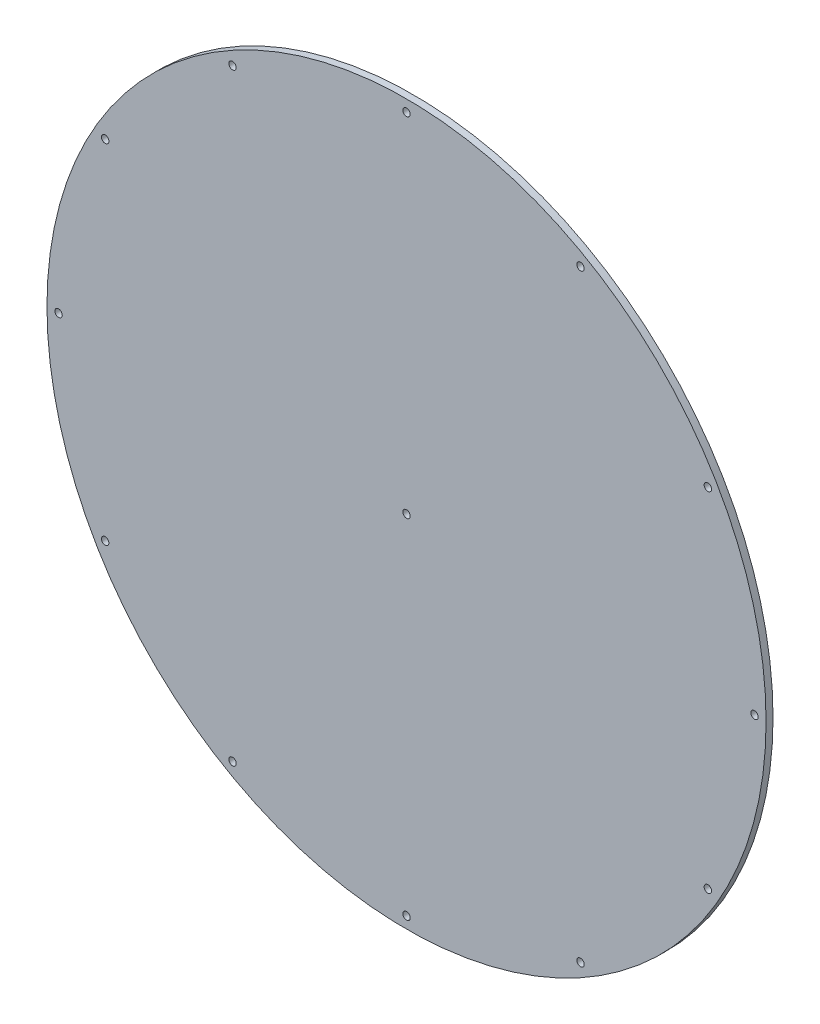
ISO-10303-21;
HEADER;
FILE_DESCRIPTION(('STEP AP214'),'2;1');
FILE_NAME('part.step','',(''),(''),'','','');
FILE_SCHEMA(('AUTOMOTIVE_DESIGN { 1 0 10303 214 1 1 1 1 }'));
ENDSEC;
DATA;
#1=APPLICATION_CONTEXT('core data for automotive mechanical design processes');
#2=APPLICATION_PROTOCOL_DEFINITION('international standard','automotive_design',2000,#1);
#3=PRODUCT_CONTEXT('',#1,'mechanical');
#4=PRODUCT('Part','Part','',(#3));
#5=PRODUCT_RELATED_PRODUCT_CATEGORY('part','',(#4));
#6=PRODUCT_DEFINITION_FORMATION('','',#4);
#7=PRODUCT_DEFINITION_CONTEXT('part definition',#1,'design');
#8=PRODUCT_DEFINITION('design','',#6,#7);
#9=PRODUCT_DEFINITION_SHAPE('','',#8);
#10=(LENGTH_UNIT() NAMED_UNIT(*) SI_UNIT(.MILLI.,.METRE.));
#11=(NAMED_UNIT(*) PLANE_ANGLE_UNIT() SI_UNIT($,.RADIAN.));
#12=(NAMED_UNIT(*) SI_UNIT($,.STERADIAN.) SOLID_ANGLE_UNIT());
#13=UNCERTAINTY_MEASURE_WITH_UNIT(LENGTH_MEASURE(1.E-05),#10,'distance_accuracy_value','');
#14=(GEOMETRIC_REPRESENTATION_CONTEXT(3) GLOBAL_UNCERTAINTY_ASSIGNED_CONTEXT((#13)) GLOBAL_UNIT_ASSIGNED_CONTEXT((#10,
#11,#12)) REPRESENTATION_CONTEXT('',''));
#15=CARTESIAN_POINT('',(0.,0.,0.));
#16=DIRECTION('',(0.,0.,1.));
#17=DIRECTION('',(1.,0.,0.));
#18=AXIS2_PLACEMENT_3D('',#15,#16,#17);
#19=CARTESIAN_POINT('',(0.,0.,3.));
#20=DIRECTION('',(0.,0.,1.));
#21=DIRECTION('',(1.,0.,0.));
#22=AXIS2_PLACEMENT_3D('',#19,#20,#21);
#23=PLANE('',#22);
#24=CARTESIAN_POINT('',(-129.903810567667,74.9999999999983,3.));
#25=DIRECTION('',(0.,0.,1.));
#26=DIRECTION('',(0.866025403784445,-0.499999999999989,0.));
#27=AXIS2_PLACEMENT_3D('',#24,#25,#26);
#28=CIRCLE('',#27,1.60019999999999);
#29=CARTESIAN_POINT('',(-128.517996716531,74.1998999999984,3.));
#30=VERTEX_POINT('',#29);
#31=EDGE_CURVE('E117',#30,#30,#28,.T.);
#32=ORIENTED_EDGE('',*,*,#31,.F.);
#33=EDGE_LOOP('',(#32));
#34=FACE_BOUND('',#33,.T.);
#35=CARTESIAN_POINT('',(-75.0000000000015,129.903810567665,3.));
#36=DIRECTION('',(0.,0.,1.));
#37=DIRECTION('',(0.50000000000001,-0.866025403784433,0.));
#38=AXIS2_PLACEMENT_3D('',#35,#36,#37);
#39=CIRCLE('',#38,1.60019999999999);
#40=CARTESIAN_POINT('',(-74.1999000000015,128.517996716529,3.));
#41=VERTEX_POINT('',#40);
#42=EDGE_CURVE('E111',#41,#41,#39,.T.);
#43=ORIENTED_EDGE('',*,*,#42,.F.);
#44=EDGE_LOOP('',(#43));
#45=FACE_BOUND('',#44,.T.);
#46=CARTESIAN_POINT('',(-1.58953630446662E-12,150.,3.));
#47=DIRECTION('',(0.,0.,1.));
#48=DIRECTION('',(0.,-1.,0.));
#49=AXIS2_PLACEMENT_3D('',#46,#47,#48);
#50=CIRCLE('',#49,1.60019999999999);
#51=CARTESIAN_POINT('',(-1.57277509915137E-12,148.3998,3.));
#52=VERTEX_POINT('',#51);
#53=EDGE_CURVE('E105',#52,#52,#50,.T.);
#54=ORIENTED_EDGE('',*,*,#53,.F.);
#55=EDGE_LOOP('',(#54));
#56=FACE_BOUND('',#55,.T.);
#57=CARTESIAN_POINT('',(74.9999999999988,129.903810567666,3.));
#58=DIRECTION('',(0.,0.,1.));
#59=DIRECTION('',(-0.499999999999992,-0.866025403784443,0.));
#60=AXIS2_PLACEMENT_3D('',#57,#58,#59);
#61=CIRCLE('',#60,1.60019999999999);
#62=CARTESIAN_POINT('',(74.1998999999988,128.517996716531,3.));
#63=VERTEX_POINT('',#62);
#64=EDGE_CURVE('E99',#63,#63,#61,.T.);
#65=ORIENTED_EDGE('',*,*,#64,.F.);
#66=EDGE_LOOP('',(#65));
#67=FACE_BOUND('',#66,.T.);
#68=CARTESIAN_POINT('',(129.903810567665,75.0000000000011,3.));
#69=DIRECTION('',(0.,0.,1.));
#70=DIRECTION('',(-0.866025403784435,-0.500000000000007,0.));
#71=AXIS2_PLACEMENT_3D('',#68,#69,#70);
#72=CIRCLE('',#71,1.60019999999999);
#73=CARTESIAN_POINT('',(128.517996716529,74.1999000000011,3.));
#74=VERTEX_POINT('',#73);
#75=EDGE_CURVE('E93',#74,#74,#72,.T.);
#76=ORIENTED_EDGE('',*,*,#75,.F.);
#77=EDGE_LOOP('',(#76));
#78=FACE_BOUND('',#77,.T.);
#79=CARTESIAN_POINT('',(150.,0.,3.));
#80=DIRECTION('',(0.,0.,1.));
#81=DIRECTION('',(-1.,0.,0.));
#82=AXIS2_PLACEMENT_3D('',#79,#80,#81);
#83=CIRCLE('',#82,1.60019999999999);
#84=CARTESIAN_POINT('',(148.3998,0.,3.));
#85=VERTEX_POINT('',#84);
#86=EDGE_CURVE('E87',#85,#85,#83,.T.);
#87=ORIENTED_EDGE('',*,*,#86,.F.);
#88=EDGE_LOOP('',(#87));
#89=FACE_BOUND('',#88,.T.);
#90=CARTESIAN_POINT('',(129.903810567666,-74.9999999999992,3.));
#91=DIRECTION('',(0.,0.,1.));
#92=DIRECTION('',(-0.866025403784442,0.499999999999995,0.));
#93=AXIS2_PLACEMENT_3D('',#90,#91,#92);
#94=CIRCLE('',#93,1.60019999999999);
#95=CARTESIAN_POINT('',(128.51799671653,-74.1998999999992,3.));
#96=VERTEX_POINT('',#95);
#97=EDGE_CURVE('E81',#96,#96,#94,.T.);
#98=ORIENTED_EDGE('',*,*,#97,.F.);
#99=EDGE_LOOP('',(#98));
#100=FACE_BOUND('',#99,.T.);
#101=CARTESIAN_POINT('',(75.0000000000006,-129.903810567665,3.));
#102=DIRECTION('',(0.,0.,1.));
#103=DIRECTION('',(-0.500000000000004,0.866025403784436,0.));
#104=AXIS2_PLACEMENT_3D('',#101,#102,#103);
#105=CIRCLE('',#104,1.60019999999999);
#106=CARTESIAN_POINT('',(74.1999000000006,-128.51799671653,3.));
#107=VERTEX_POINT('',#106);
#108=EDGE_CURVE('E75',#107,#107,#105,.T.);
#109=ORIENTED_EDGE('',*,*,#108,.F.);
#110=EDGE_LOOP('',(#109));
#111=FACE_BOUND('',#110,.T.);
#112=CARTESIAN_POINT('',(5.4209190281368E-13,-150.,3.));
#113=DIRECTION('',(0.,0.,1.));
#114=DIRECTION('',(0.,1.,0.));
#115=AXIS2_PLACEMENT_3D('',#112,#113,#114);
#116=CIRCLE('',#115,1.60019999999999);
#117=CARTESIAN_POINT('',(5.36504834375264E-13,-148.3998,3.));
#118=VERTEX_POINT('',#117);
#119=EDGE_CURVE('E69',#118,#118,#116,.T.);
#120=ORIENTED_EDGE('',*,*,#119,.F.);
#121=EDGE_LOOP('',(#120));
#122=FACE_BOUND('',#121,.T.);
#123=CARTESIAN_POINT('',(-74.9999999999997,-129.903810567666,3.));
#124=DIRECTION('',(0.,0.,1.));
#125=DIRECTION('',(0.499999999999998,0.86602540378444,0.));
#126=AXIS2_PLACEMENT_3D('',#123,#124,#125);
#127=CIRCLE('',#126,1.60019999999999);
#128=CARTESIAN_POINT('',(-74.1998999999997,-128.51799671653,3.));
#129=VERTEX_POINT('',#128);
#130=EDGE_CURVE('E63',#129,#129,#127,.T.);
#131=ORIENTED_EDGE('',*,*,#130,.F.);
#132=EDGE_LOOP('',(#131));
#133=FACE_BOUND('',#132,.T.);
#134=CARTESIAN_POINT('',(-129.903810567666,-75.0000000000002,3.));
#135=DIRECTION('',(0.,0.,1.));
#136=DIRECTION('',(0.866025403784438,0.500000000000001,0.));
#137=AXIS2_PLACEMENT_3D('',#134,#135,#136);
#138=CIRCLE('',#137,1.60019999999999);
#139=CARTESIAN_POINT('',(-128.51799671653,-74.1999000000002,3.));
#140=VERTEX_POINT('',#139);
#141=EDGE_CURVE('E57',#140,#140,#138,.T.);
#142=ORIENTED_EDGE('',*,*,#141,.F.);
#143=EDGE_LOOP('',(#142));
#144=FACE_BOUND('',#143,.T.);
#145=CARTESIAN_POINT('',(-150.,0.,3.));
#146=DIRECTION('',(0.,0.,1.));
#147=DIRECTION('',(1.,0.,0.));
#148=AXIS2_PLACEMENT_3D('',#145,#146,#147);
#149=CIRCLE('',#148,1.60019999999999);
#150=CARTESIAN_POINT('',(-148.3998,0.,3.));
#151=VERTEX_POINT('',#150);
#152=EDGE_CURVE('E51',#151,#151,#149,.T.);
#153=ORIENTED_EDGE('',*,*,#152,.F.);
#154=EDGE_LOOP('',(#153));
#155=FACE_BOUND('',#154,.T.);
#156=CARTESIAN_POINT('',(0.,0.,3.));
#157=DIRECTION('',(0.,0.,1.));
#158=DIRECTION('',(1.,0.,0.));
#159=AXIS2_PLACEMENT_3D('',#156,#157,#158);
#160=CIRCLE('',#159,155.);
#161=CARTESIAN_POINT('',(155.,0.,3.));
#162=VERTEX_POINT('',#161);
#163=EDGE_CURVE('E10',#162,#162,#160,.T.);
#164=ORIENTED_EDGE('',*,*,#163,.T.);
#165=EDGE_LOOP('',(#164));
#166=FACE_BOUND('',#165,.T.);
#167=CARTESIAN_POINT('',(0.,0.,3.));
#168=DIRECTION('',(0.,0.,1.));
#169=DIRECTION('',(1.,0.,0.));
#170=AXIS2_PLACEMENT_3D('',#167,#168,#169);
#171=CIRCLE('',#170,1.6);
#172=CARTESIAN_POINT('',(1.6,0.,3.));
#173=VERTEX_POINT('',#172);
#174=EDGE_CURVE('E43',#173,#173,#171,.T.);
#175=ORIENTED_EDGE('',*,*,#174,.F.);
#176=EDGE_LOOP('',(#175));
#177=FACE_BOUND('',#176,.T.);
#178=ADVANCED_FACE('F32',(#34,#45,#56,#67,#78,#89,#100,#111,#122,#133,#144,#155,#166,#177),#23,.T.);
#179=CARTESIAN_POINT('',(0.,0.,0.));
#180=DIRECTION('',(0.,0.,1.));
#181=DIRECTION('',(1.,0.,0.));
#182=AXIS2_PLACEMENT_3D('',#179,#180,#181);
#183=PLANE('',#182);
#184=CARTESIAN_POINT('',(-129.903810567667,74.9999999999983,0.));
#185=DIRECTION('',(0.,0.,1.));
#186=DIRECTION('',(0.866025403784445,-0.499999999999989,0.));
#187=AXIS2_PLACEMENT_3D('',#184,#185,#186);
#188=CIRCLE('',#187,1.60019999999999);
#189=CARTESIAN_POINT('',(-128.517996716531,74.1998999999984,0.));
#190=VERTEX_POINT('',#189);
#191=EDGE_CURVE('E114',#190,#190,#188,.T.);
#192=ORIENTED_EDGE('',*,*,#191,.T.);
#193=EDGE_LOOP('',(#192));
#194=FACE_BOUND('',#193,.T.);
#195=CARTESIAN_POINT('',(-75.0000000000015,129.903810567665,0.));
#196=DIRECTION('',(0.,0.,1.));
#197=DIRECTION('',(0.50000000000001,-0.866025403784433,0.));
#198=AXIS2_PLACEMENT_3D('',#195,#196,#197);
#199=CIRCLE('',#198,1.60019999999999);
#200=CARTESIAN_POINT('',(-74.1999000000015,128.517996716529,0.));
#201=VERTEX_POINT('',#200);
#202=EDGE_CURVE('E108',#201,#201,#199,.T.);
#203=ORIENTED_EDGE('',*,*,#202,.T.);
#204=EDGE_LOOP('',(#203));
#205=FACE_BOUND('',#204,.T.);
#206=CARTESIAN_POINT('',(-1.58953630446662E-12,150.,0.));
#207=DIRECTION('',(0.,0.,1.));
#208=DIRECTION('',(0.,-1.,0.));
#209=AXIS2_PLACEMENT_3D('',#206,#207,#208);
#210=CIRCLE('',#209,1.60019999999999);
#211=CARTESIAN_POINT('',(-1.57277509915137E-12,148.3998,0.));
#212=VERTEX_POINT('',#211);
#213=EDGE_CURVE('E102',#212,#212,#210,.T.);
#214=ORIENTED_EDGE('',*,*,#213,.T.);
#215=EDGE_LOOP('',(#214));
#216=FACE_BOUND('',#215,.T.);
#217=CARTESIAN_POINT('',(74.9999999999988,129.903810567666,0.));
#218=DIRECTION('',(0.,0.,1.));
#219=DIRECTION('',(-0.499999999999992,-0.866025403784443,0.));
#220=AXIS2_PLACEMENT_3D('',#217,#218,#219);
#221=CIRCLE('',#220,1.60019999999999);
#222=CARTESIAN_POINT('',(74.1998999999988,128.517996716531,0.));
#223=VERTEX_POINT('',#222);
#224=EDGE_CURVE('E96',#223,#223,#221,.T.);
#225=ORIENTED_EDGE('',*,*,#224,.T.);
#226=EDGE_LOOP('',(#225));
#227=FACE_BOUND('',#226,.T.);
#228=CARTESIAN_POINT('',(129.903810567665,75.0000000000011,0.));
#229=DIRECTION('',(0.,0.,1.));
#230=DIRECTION('',(-0.866025403784435,-0.500000000000007,0.));
#231=AXIS2_PLACEMENT_3D('',#228,#229,#230);
#232=CIRCLE('',#231,1.60019999999999);
#233=CARTESIAN_POINT('',(128.517996716529,74.1999000000011,0.));
#234=VERTEX_POINT('',#233);
#235=EDGE_CURVE('E90',#234,#234,#232,.T.);
#236=ORIENTED_EDGE('',*,*,#235,.T.);
#237=EDGE_LOOP('',(#236));
#238=FACE_BOUND('',#237,.T.);
#239=CARTESIAN_POINT('',(150.,0.,0.));
#240=DIRECTION('',(0.,0.,1.));
#241=DIRECTION('',(-1.,0.,0.));
#242=AXIS2_PLACEMENT_3D('',#239,#240,#241);
#243=CIRCLE('',#242,1.60019999999999);
#244=CARTESIAN_POINT('',(148.3998,0.,0.));
#245=VERTEX_POINT('',#244);
#246=EDGE_CURVE('E84',#245,#245,#243,.T.);
#247=ORIENTED_EDGE('',*,*,#246,.T.);
#248=EDGE_LOOP('',(#247));
#249=FACE_BOUND('',#248,.T.);
#250=CARTESIAN_POINT('',(129.903810567666,-74.9999999999992,0.));
#251=DIRECTION('',(0.,0.,1.));
#252=DIRECTION('',(-0.866025403784442,0.499999999999995,0.));
#253=AXIS2_PLACEMENT_3D('',#250,#251,#252);
#254=CIRCLE('',#253,1.60019999999999);
#255=CARTESIAN_POINT('',(128.51799671653,-74.1998999999992,0.));
#256=VERTEX_POINT('',#255);
#257=EDGE_CURVE('E78',#256,#256,#254,.T.);
#258=ORIENTED_EDGE('',*,*,#257,.T.);
#259=EDGE_LOOP('',(#258));
#260=FACE_BOUND('',#259,.T.);
#261=CARTESIAN_POINT('',(75.0000000000006,-129.903810567665,0.));
#262=DIRECTION('',(0.,0.,1.));
#263=DIRECTION('',(-0.500000000000004,0.866025403784436,0.));
#264=AXIS2_PLACEMENT_3D('',#261,#262,#263);
#265=CIRCLE('',#264,1.60019999999999);
#266=CARTESIAN_POINT('',(74.1999000000006,-128.51799671653,0.));
#267=VERTEX_POINT('',#266);
#268=EDGE_CURVE('E72',#267,#267,#265,.T.);
#269=ORIENTED_EDGE('',*,*,#268,.T.);
#270=EDGE_LOOP('',(#269));
#271=FACE_BOUND('',#270,.T.);
#272=CARTESIAN_POINT('',(5.4209190281368E-13,-150.,0.));
#273=DIRECTION('',(0.,0.,1.));
#274=DIRECTION('',(0.,1.,0.));
#275=AXIS2_PLACEMENT_3D('',#272,#273,#274);
#276=CIRCLE('',#275,1.60019999999999);
#277=CARTESIAN_POINT('',(5.36504834375264E-13,-148.3998,0.));
#278=VERTEX_POINT('',#277);
#279=EDGE_CURVE('E66',#278,#278,#276,.T.);
#280=ORIENTED_EDGE('',*,*,#279,.T.);
#281=EDGE_LOOP('',(#280));
#282=FACE_BOUND('',#281,.T.);
#283=CARTESIAN_POINT('',(-74.9999999999997,-129.903810567666,0.));
#284=DIRECTION('',(0.,0.,1.));
#285=DIRECTION('',(0.499999999999998,0.86602540378444,0.));
#286=AXIS2_PLACEMENT_3D('',#283,#284,#285);
#287=CIRCLE('',#286,1.60019999999999);
#288=CARTESIAN_POINT('',(-74.1998999999997,-128.51799671653,0.));
#289=VERTEX_POINT('',#288);
#290=EDGE_CURVE('E60',#289,#289,#287,.T.);
#291=ORIENTED_EDGE('',*,*,#290,.T.);
#292=EDGE_LOOP('',(#291));
#293=FACE_BOUND('',#292,.T.);
#294=CARTESIAN_POINT('',(-129.903810567666,-75.0000000000002,0.));
#295=DIRECTION('',(0.,0.,1.));
#296=DIRECTION('',(0.866025403784438,0.500000000000001,0.));
#297=AXIS2_PLACEMENT_3D('',#294,#295,#296);
#298=CIRCLE('',#297,1.60019999999999);
#299=CARTESIAN_POINT('',(-128.51799671653,-74.1999000000002,0.));
#300=VERTEX_POINT('',#299);
#301=EDGE_CURVE('E54',#300,#300,#298,.T.);
#302=ORIENTED_EDGE('',*,*,#301,.T.);
#303=EDGE_LOOP('',(#302));
#304=FACE_BOUND('',#303,.T.);
#305=CARTESIAN_POINT('',(-150.,0.,0.));
#306=DIRECTION('',(0.,0.,1.));
#307=DIRECTION('',(1.,0.,0.));
#308=AXIS2_PLACEMENT_3D('',#305,#306,#307);
#309=CIRCLE('',#308,1.60019999999999);
#310=CARTESIAN_POINT('',(-148.3998,0.,0.));
#311=VERTEX_POINT('',#310);
#312=EDGE_CURVE('E48',#311,#311,#309,.T.);
#313=ORIENTED_EDGE('',*,*,#312,.T.);
#314=EDGE_LOOP('',(#313));
#315=FACE_BOUND('',#314,.T.);
#316=CARTESIAN_POINT('',(0.,0.,0.));
#317=DIRECTION('',(0.,0.,1.));
#318=DIRECTION('',(1.,0.,0.));
#319=AXIS2_PLACEMENT_3D('',#316,#317,#318);
#320=CIRCLE('',#319,155.);
#321=CARTESIAN_POINT('',(155.,0.,0.));
#322=VERTEX_POINT('',#321);
#323=EDGE_CURVE('E36',#322,#322,#320,.T.);
#324=ORIENTED_EDGE('',*,*,#323,.F.);
#325=EDGE_LOOP('',(#324));
#326=FACE_BOUND('',#325,.T.);
#327=CARTESIAN_POINT('',(0.,0.,0.));
#328=DIRECTION('',(0.,0.,1.));
#329=DIRECTION('',(1.,0.,0.));
#330=AXIS2_PLACEMENT_3D('',#327,#328,#329);
#331=CIRCLE('',#330,1.6);
#332=CARTESIAN_POINT('',(1.6,0.,0.));
#333=VERTEX_POINT('',#332);
#334=EDGE_CURVE('E45',#333,#333,#331,.T.);
#335=ORIENTED_EDGE('',*,*,#334,.T.);
#336=EDGE_LOOP('',(#335));
#337=FACE_BOUND('',#336,.T.);
#338=ADVANCED_FACE('F123',(#194,#205,#216,#227,#238,#249,#260,#271,#282,#293,#304,#315,#326,
#337),#183,.F.);
#339=CARTESIAN_POINT('',(0.,0.,3.));
#340=DIRECTION('',(0.,0.,-1.));
#341=DIRECTION('',(-1.,0.,0.));
#342=AXIS2_PLACEMENT_3D('',#339,#340,#341);
#343=CYLINDRICAL_SURFACE('',#342,155.);
#344=ORIENTED_EDGE('',*,*,#163,.F.);
#345=EDGE_LOOP('',(#344));
#346=FACE_BOUND('',#345,.T.);
#347=ORIENTED_EDGE('',*,*,#323,.T.);
#348=EDGE_LOOP('',(#347));
#349=FACE_BOUND('',#348,.T.);
#350=ADVANCED_FACE('F34',(#346,#349),#343,.T.);
#351=CARTESIAN_POINT('',(0.,0.,3.));
#352=DIRECTION('',(0.,0.,-1.));
#353=DIRECTION('',(-1.,0.,0.));
#354=AXIS2_PLACEMENT_3D('',#351,#352,#353);
#355=CYLINDRICAL_SURFACE('',#354,1.6);
#356=ORIENTED_EDGE('',*,*,#174,.T.);
#357=EDGE_LOOP('',(#356));
#358=FACE_BOUND('',#357,.T.);
#359=ORIENTED_EDGE('',*,*,#334,.F.);
#360=EDGE_LOOP('',(#359));
#361=FACE_BOUND('',#360,.T.);
#362=ADVANCED_FACE('F160',(#358,#361),#355,.F.);
#363=CARTESIAN_POINT('',(-150.,0.,0.));
#364=DIRECTION('',(0.,0.,1.));
#365=DIRECTION('',(1.,0.,0.));
#366=AXIS2_PLACEMENT_3D('',#363,#364,#365);
#367=CYLINDRICAL_SURFACE('',#366,1.60019999999999);
#368=ORIENTED_EDGE('',*,*,#312,.F.);
#369=EDGE_LOOP('',(#368));
#370=FACE_BOUND('',#369,.T.);
#371=ORIENTED_EDGE('',*,*,#152,.T.);
#372=EDGE_LOOP('',(#371));
#373=FACE_BOUND('',#372,.T.);
#374=ADVANCED_FACE('F163',(#370,#373),#367,.F.);
#375=CARTESIAN_POINT('',(-129.903810567666,-75.0000000000002,0.));
#376=DIRECTION('',(0.,0.,1.));
#377=DIRECTION('',(1.,0.,0.));
#378=AXIS2_PLACEMENT_3D('',#375,#376,#377);
#379=CYLINDRICAL_SURFACE('',#378,1.60019999999999);
#380=ORIENTED_EDGE('',*,*,#301,.F.);
#381=EDGE_LOOP('',(#380));
#382=FACE_BOUND('',#381,.T.);
#383=ORIENTED_EDGE('',*,*,#141,.T.);
#384=EDGE_LOOP('',(#383));
#385=FACE_BOUND('',#384,.T.);
#386=ADVANCED_FACE('F175',(#382,#385),#379,.F.);
#387=CARTESIAN_POINT('',(-74.9999999999997,-129.903810567666,0.));
#388=DIRECTION('',(0.,0.,1.));
#389=DIRECTION('',(1.,0.,0.));
#390=AXIS2_PLACEMENT_3D('',#387,#388,#389);
#391=CYLINDRICAL_SURFACE('',#390,1.60019999999999);
#392=ORIENTED_EDGE('',*,*,#290,.F.);
#393=EDGE_LOOP('',(#392));
#394=FACE_BOUND('',#393,.T.);
#395=ORIENTED_EDGE('',*,*,#130,.T.);
#396=EDGE_LOOP('',(#395));
#397=FACE_BOUND('',#396,.T.);
#398=ADVANCED_FACE('F179',(#394,#397),#391,.F.);
#399=CARTESIAN_POINT('',(5.4209190281368E-13,-150.,0.));
#400=DIRECTION('',(0.,0.,1.));
#401=DIRECTION('',(1.,0.,0.));
#402=AXIS2_PLACEMENT_3D('',#399,#400,#401);
#403=CYLINDRICAL_SURFACE('',#402,1.60019999999999);
#404=ORIENTED_EDGE('',*,*,#279,.F.);
#405=EDGE_LOOP('',(#404));
#406=FACE_BOUND('',#405,.T.);
#407=ORIENTED_EDGE('',*,*,#119,.T.);
#408=EDGE_LOOP('',(#407));
#409=FACE_BOUND('',#408,.T.);
#410=ADVANCED_FACE('F183',(#406,#409),#403,.F.);
#411=CARTESIAN_POINT('',(75.0000000000006,-129.903810567665,0.));
#412=DIRECTION('',(0.,0.,1.));
#413=DIRECTION('',(1.,0.,0.));
#414=AXIS2_PLACEMENT_3D('',#411,#412,#413);
#415=CYLINDRICAL_SURFACE('',#414,1.60019999999999);
#416=ORIENTED_EDGE('',*,*,#268,.F.);
#417=EDGE_LOOP('',(#416));
#418=FACE_BOUND('',#417,.T.);
#419=ORIENTED_EDGE('',*,*,#108,.T.);
#420=EDGE_LOOP('',(#419));
#421=FACE_BOUND('',#420,.T.);
#422=ADVANCED_FACE('F187',(#418,#421),#415,.F.);
#423=CARTESIAN_POINT('',(129.903810567666,-74.9999999999992,0.));
#424=DIRECTION('',(0.,0.,1.));
#425=DIRECTION('',(1.,0.,0.));
#426=AXIS2_PLACEMENT_3D('',#423,#424,#425);
#427=CYLINDRICAL_SURFACE('',#426,1.60019999999999);
#428=ORIENTED_EDGE('',*,*,#257,.F.);
#429=EDGE_LOOP('',(#428));
#430=FACE_BOUND('',#429,.T.);
#431=ORIENTED_EDGE('',*,*,#97,.T.);
#432=EDGE_LOOP('',(#431));
#433=FACE_BOUND('',#432,.T.);
#434=ADVANCED_FACE('F191',(#430,#433),#427,.F.);
#435=CARTESIAN_POINT('',(150.,0.,0.));
#436=DIRECTION('',(0.,0.,1.));
#437=DIRECTION('',(1.,0.,0.));
#438=AXIS2_PLACEMENT_3D('',#435,#436,#437);
#439=CYLINDRICAL_SURFACE('',#438,1.60019999999999);
#440=ORIENTED_EDGE('',*,*,#246,.F.);
#441=EDGE_LOOP('',(#440));
#442=FACE_BOUND('',#441,.T.);
#443=ORIENTED_EDGE('',*,*,#86,.T.);
#444=EDGE_LOOP('',(#443));
#445=FACE_BOUND('',#444,.T.);
#446=ADVANCED_FACE('F195',(#442,#445),#439,.F.);
#447=CARTESIAN_POINT('',(129.903810567665,75.0000000000011,0.));
#448=DIRECTION('',(0.,0.,1.));
#449=DIRECTION('',(1.,0.,0.));
#450=AXIS2_PLACEMENT_3D('',#447,#448,#449);
#451=CYLINDRICAL_SURFACE('',#450,1.60019999999999);
#452=ORIENTED_EDGE('',*,*,#235,.F.);
#453=EDGE_LOOP('',(#452));
#454=FACE_BOUND('',#453,.T.);
#455=ORIENTED_EDGE('',*,*,#75,.T.);
#456=EDGE_LOOP('',(#455));
#457=FACE_BOUND('',#456,.T.);
#458=ADVANCED_FACE('F199',(#454,#457),#451,.F.);
#459=CARTESIAN_POINT('',(74.9999999999988,129.903810567666,0.));
#460=DIRECTION('',(0.,0.,1.));
#461=DIRECTION('',(1.,0.,0.));
#462=AXIS2_PLACEMENT_3D('',#459,#460,#461);
#463=CYLINDRICAL_SURFACE('',#462,1.60019999999999);
#464=ORIENTED_EDGE('',*,*,#224,.F.);
#465=EDGE_LOOP('',(#464));
#466=FACE_BOUND('',#465,.T.);
#467=ORIENTED_EDGE('',*,*,#64,.T.);
#468=EDGE_LOOP('',(#467));
#469=FACE_BOUND('',#468,.T.);
#470=ADVANCED_FACE('F203',(#466,#469),#463,.F.);
#471=CARTESIAN_POINT('',(-1.58953630446662E-12,150.,0.));
#472=DIRECTION('',(0.,0.,1.));
#473=DIRECTION('',(1.,0.,0.));
#474=AXIS2_PLACEMENT_3D('',#471,#472,#473);
#475=CYLINDRICAL_SURFACE('',#474,1.60019999999999);
#476=ORIENTED_EDGE('',*,*,#213,.F.);
#477=EDGE_LOOP('',(#476));
#478=FACE_BOUND('',#477,.T.);
#479=ORIENTED_EDGE('',*,*,#53,.T.);
#480=EDGE_LOOP('',(#479));
#481=FACE_BOUND('',#480,.T.);
#482=ADVANCED_FACE('F207',(#478,#481),#475,.F.);
#483=CARTESIAN_POINT('',(-75.0000000000015,129.903810567665,0.));
#484=DIRECTION('',(0.,0.,1.));
#485=DIRECTION('',(1.,0.,0.));
#486=AXIS2_PLACEMENT_3D('',#483,#484,#485);
#487=CYLINDRICAL_SURFACE('',#486,1.60019999999999);
#488=ORIENTED_EDGE('',*,*,#202,.F.);
#489=EDGE_LOOP('',(#488));
#490=FACE_BOUND('',#489,.T.);
#491=ORIENTED_EDGE('',*,*,#42,.T.);
#492=EDGE_LOOP('',(#491));
#493=FACE_BOUND('',#492,.T.);
#494=ADVANCED_FACE('F129',(#490,#493),#487,.F.);
#495=CARTESIAN_POINT('',(-129.903810567667,74.9999999999983,0.));
#496=DIRECTION('',(0.,0.,1.));
#497=DIRECTION('',(1.,0.,0.));
#498=AXIS2_PLACEMENT_3D('',#495,#496,#497);
#499=CYLINDRICAL_SURFACE('',#498,1.60019999999999);
#500=ORIENTED_EDGE('',*,*,#191,.F.);
#501=EDGE_LOOP('',(#500));
#502=FACE_BOUND('',#501,.T.);
#503=ORIENTED_EDGE('',*,*,#31,.T.);
#504=EDGE_LOOP('',(#503));
#505=FACE_BOUND('',#504,.T.);
#506=ADVANCED_FACE('F126',(#502,#505),#499,.F.);
#507=CLOSED_SHELL('',(#178,#338,#350,#362,#374,#386,#398,#410,#422,#434,#446,#458,#470,#482,
#494,#506));
#508=MANIFOLD_SOLID_BREP('B2',#507);
#509=ADVANCED_BREP_SHAPE_REPRESENTATION('',(#18,#508),#14);
#510=SHAPE_DEFINITION_REPRESENTATION(#9,#509);
ENDSEC;
END-ISO-10303-21;
